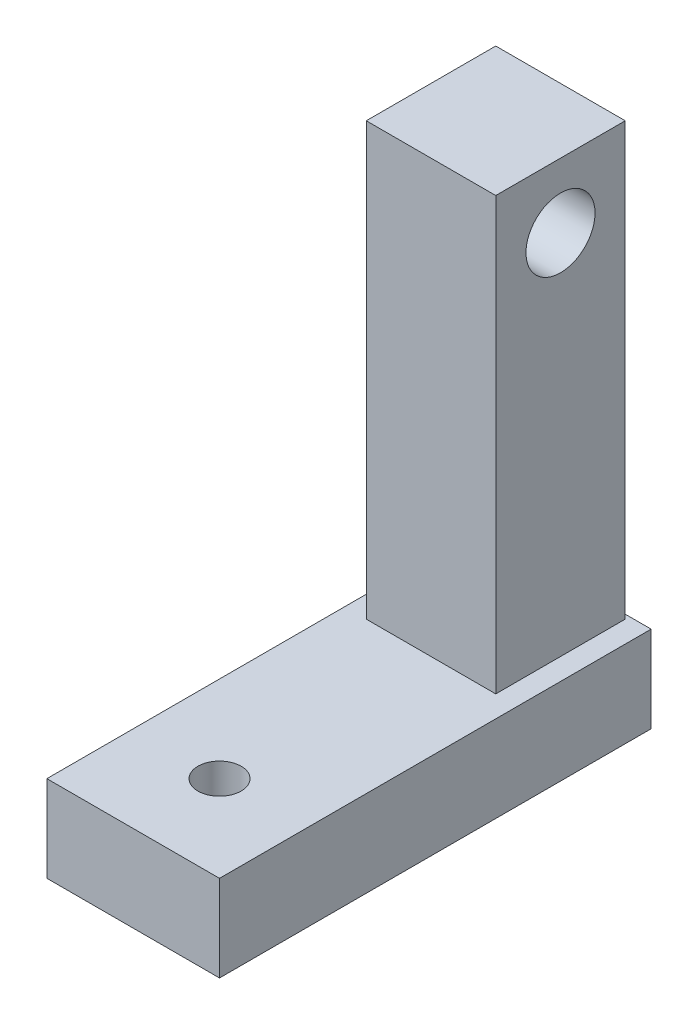
ISO-10303-21;
HEADER;
FILE_DESCRIPTION(('STEP AP214'),'2;1');
FILE_NAME('part.step','',(''),(''),'','','');
FILE_SCHEMA(('AUTOMOTIVE_DESIGN { 1 0 10303 214 1 1 1 1 }'));
ENDSEC;
DATA;
#1=APPLICATION_CONTEXT('core data for automotive mechanical design processes');
#2=APPLICATION_PROTOCOL_DEFINITION('international standard','automotive_design',2000,#1);
#3=PRODUCT_CONTEXT('',#1,'mechanical');
#4=PRODUCT('Part','Part','',(#3));
#5=PRODUCT_RELATED_PRODUCT_CATEGORY('part','',(#4));
#6=PRODUCT_DEFINITION_FORMATION('','',#4);
#7=PRODUCT_DEFINITION_CONTEXT('part definition',#1,'design');
#8=PRODUCT_DEFINITION('design','',#6,#7);
#9=PRODUCT_DEFINITION_SHAPE('','',#8);
#10=(LENGTH_UNIT() NAMED_UNIT(*) SI_UNIT(.MILLI.,.METRE.));
#11=(NAMED_UNIT(*) PLANE_ANGLE_UNIT() SI_UNIT($,.RADIAN.));
#12=(NAMED_UNIT(*) SI_UNIT($,.STERADIAN.) SOLID_ANGLE_UNIT());
#13=UNCERTAINTY_MEASURE_WITH_UNIT(LENGTH_MEASURE(1.E-05),#10,'distance_accuracy_value','');
#14=(GEOMETRIC_REPRESENTATION_CONTEXT(3) GLOBAL_UNCERTAINTY_ASSIGNED_CONTEXT((#13)) GLOBAL_UNIT_ASSIGNED_CONTEXT((#10,
#11,#12)) REPRESENTATION_CONTEXT('',''));
#15=CARTESIAN_POINT('',(0.,0.,0.));
#16=DIRECTION('',(0.,0.,1.));
#17=DIRECTION('',(1.,0.,0.));
#18=AXIS2_PLACEMENT_3D('',#15,#16,#17);
#19=CARTESIAN_POINT('',(-7.50000000000001,60.,-24.5));
#20=DIRECTION('',(1.,0.,0.));
#21=DIRECTION('',(0.,0.,-1.));
#22=AXIS2_PLACEMENT_3D('',#19,#20,#21);
#23=PLANE('',#22);
#24=CARTESIAN_POINT('',(-7.50000000000001,52.5,-17.));
#25=DIRECTION('',(1.,0.,0.));
#26=DIRECTION('',(0.,0.,-1.));
#27=AXIS2_PLACEMENT_3D('',#24,#25,#26);
#28=CIRCLE('',#27,3.99999999999999);
#29=CARTESIAN_POINT('',(-7.50000000000001,52.5,-21.));
#30=VERTEX_POINT('',#29);
#31=EDGE_CURVE('E109',#30,#30,#28,.T.);
#32=ORIENTED_EDGE('',*,*,#31,.T.);
#33=EDGE_LOOP('',(#32));
#34=FACE_BOUND('',#33,.T.);
#35=DIRECTION('',(0.,0.,1.));
#36=VECTOR('',#35,1.);
#37=CARTESIAN_POINT('',(-7.50000000000001,10.,-24.5));
#38=LINE('',#37,#36);
#39=CARTESIAN_POINT('',(-7.50000000000001,10.,-24.5));
#40=VERTEX_POINT('',#39);
#41=CARTESIAN_POINT('',(-7.50000000000001,10.,-9.5));
#42=VERTEX_POINT('',#41);
#43=EDGE_CURVE('E106',#40,#42,#38,.T.);
#44=ORIENTED_EDGE('',*,*,#43,.T.);
#45=DIRECTION('',(0.,-1.,0.));
#46=VECTOR('',#45,1.);
#47=CARTESIAN_POINT('',(-7.50000000000001,60.,-9.5));
#48=LINE('',#47,#46);
#49=CARTESIAN_POINT('',(-7.50000000000001,60.,-9.5));
#50=VERTEX_POINT('',#49);
#51=EDGE_CURVE('E12',#50,#42,#48,.T.);
#52=ORIENTED_EDGE('',*,*,#51,.F.);
#53=DIRECTION('',(0.,0.,1.));
#54=VECTOR('',#53,1.);
#55=CARTESIAN_POINT('',(-7.50000000000001,60.,-24.5));
#56=LINE('',#55,#54);
#57=CARTESIAN_POINT('',(-7.50000000000001,60.,-24.5));
#58=VERTEX_POINT('',#57);
#59=EDGE_CURVE('E94',#58,#50,#56,.T.);
#60=ORIENTED_EDGE('',*,*,#59,.F.);
#61=DIRECTION('',(0.,-1.,0.));
#62=VECTOR('',#61,1.);
#63=CARTESIAN_POINT('',(-7.50000000000001,60.,-24.5));
#64=LINE('',#63,#62);
#65=EDGE_CURVE('E102',#58,#40,#64,.T.);
#66=ORIENTED_EDGE('',*,*,#65,.T.);
#67=EDGE_LOOP('',(#44,#52,#60,#66));
#68=FACE_BOUND('',#67,.T.);
#69=ADVANCED_FACE('F43',(#34,#68),#23,.F.);
#70=CARTESIAN_POINT('',(-7.50000000000001,60.,-9.5));
#71=DIRECTION('',(0.,0.,-1.));
#72=DIRECTION('',(-1.,0.,0.));
#73=AXIS2_PLACEMENT_3D('',#70,#71,#72);
#74=PLANE('',#73);
#75=DIRECTION('',(1.,0.,0.));
#76=VECTOR('',#75,1.);
#77=CARTESIAN_POINT('',(-7.50000000000001,10.,-9.5));
#78=LINE('',#77,#76);
#79=CARTESIAN_POINT('',(7.50000000000001,10.,-9.5));
#80=VERTEX_POINT('',#79);
#81=EDGE_CURVE('E98',#42,#80,#78,.T.);
#82=ORIENTED_EDGE('',*,*,#81,.T.);
#83=DIRECTION('',(0.,-1.,0.));
#84=VECTOR('',#83,1.);
#85=CARTESIAN_POINT('',(7.50000000000001,60.,-9.5));
#86=LINE('',#85,#84);
#87=CARTESIAN_POINT('',(7.50000000000001,60.,-9.5));
#88=VERTEX_POINT('',#87);
#89=EDGE_CURVE('E51',#88,#80,#86,.T.);
#90=ORIENTED_EDGE('',*,*,#89,.F.);
#91=DIRECTION('',(1.,0.,0.));
#92=VECTOR('',#91,1.);
#93=CARTESIAN_POINT('',(-7.50000000000001,60.,-9.5));
#94=LINE('',#93,#92);
#95=EDGE_CURVE('E89',#50,#88,#94,.T.);
#96=ORIENTED_EDGE('',*,*,#95,.F.);
#97=ORIENTED_EDGE('',*,*,#51,.T.);
#98=EDGE_LOOP('',(#82,#90,#96,#97));
#99=FACE_BOUND('',#98,.T.);
#100=ADVANCED_FACE('F97',(#99),#74,.F.);
#101=CARTESIAN_POINT('',(7.49999999999999,60.,-24.5));
#102=DIRECTION('',(-1.,0.,0.));
#103=DIRECTION('',(0.,0.,1.));
#104=AXIS2_PLACEMENT_3D('',#101,#102,#103);
#105=PLANE('',#104);
#106=CARTESIAN_POINT('',(7.5,52.5,-17.));
#107=DIRECTION('',(1.,0.,0.));
#108=DIRECTION('',(0.,0.,-1.));
#109=AXIS2_PLACEMENT_3D('',#106,#107,#108);
#110=CIRCLE('',#109,3.99999999999999);
#111=CARTESIAN_POINT('',(7.5,52.5,-21.));
#112=VERTEX_POINT('',#111);
#113=EDGE_CURVE('E122',#112,#112,#110,.T.);
#114=ORIENTED_EDGE('',*,*,#113,.F.);
#115=EDGE_LOOP('',(#114));
#116=FACE_BOUND('',#115,.T.);
#117=DIRECTION('',(0.,0.,-1.));
#118=VECTOR('',#117,1.);
#119=CARTESIAN_POINT('',(7.49999999999999,10.,-24.5));
#120=LINE('',#119,#118);
#121=CARTESIAN_POINT('',(7.49999999999999,10.,-24.5));
#122=VERTEX_POINT('',#121);
#123=EDGE_CURVE('E76',#80,#122,#120,.T.);
#124=ORIENTED_EDGE('',*,*,#123,.T.);
#125=DIRECTION('',(0.,-1.,0.));
#126=VECTOR('',#125,1.);
#127=CARTESIAN_POINT('',(7.49999999999999,60.,-24.5));
#128=LINE('',#127,#126);
#129=CARTESIAN_POINT('',(7.49999999999999,60.,-24.5));
#130=VERTEX_POINT('',#129);
#131=EDGE_CURVE('E99',#130,#122,#128,.T.);
#132=ORIENTED_EDGE('',*,*,#131,.F.);
#133=DIRECTION('',(0.,0.,-1.));
#134=VECTOR('',#133,1.);
#135=CARTESIAN_POINT('',(7.49999999999999,60.,-24.5));
#136=LINE('',#135,#134);
#137=EDGE_CURVE('E92',#88,#130,#136,.T.);
#138=ORIENTED_EDGE('',*,*,#137,.F.);
#139=ORIENTED_EDGE('',*,*,#89,.T.);
#140=EDGE_LOOP('',(#124,#132,#138,#139));
#141=FACE_BOUND('',#140,.T.);
#142=ADVANCED_FACE('F100',(#116,#141),#105,.F.);
#143=CARTESIAN_POINT('',(-7.50000000000001,60.,-24.5));
#144=DIRECTION('',(0.,0.,1.));
#145=DIRECTION('',(1.,0.,0.));
#146=AXIS2_PLACEMENT_3D('',#143,#144,#145);
#147=PLANE('',#146);
#148=DIRECTION('',(-1.,0.,0.));
#149=VECTOR('',#148,1.);
#150=CARTESIAN_POINT('',(-7.50000000000001,10.,-24.5));
#151=LINE('',#150,#149);
#152=EDGE_CURVE('E82',#122,#40,#151,.T.);
#153=ORIENTED_EDGE('',*,*,#152,.T.);
#154=ORIENTED_EDGE('',*,*,#65,.F.);
#155=DIRECTION('',(-1.,0.,0.));
#156=VECTOR('',#155,1.);
#157=CARTESIAN_POINT('',(-7.50000000000001,60.,-24.5));
#158=LINE('',#157,#156);
#159=EDGE_CURVE('E59',#130,#58,#158,.T.);
#160=ORIENTED_EDGE('',*,*,#159,.F.);
#161=ORIENTED_EDGE('',*,*,#131,.T.);
#162=EDGE_LOOP('',(#153,#154,#160,#161));
#163=FACE_BOUND('',#162,.T.);
#164=ADVANCED_FACE('F114',(#163),#147,.F.);
#165=CARTESIAN_POINT('',(0.,60.,0.));
#166=DIRECTION('',(0.,1.,0.));
#167=DIRECTION('',(0.,0.,1.));
#168=AXIS2_PLACEMENT_3D('',#165,#166,#167);
#169=PLANE('',#168);
#170=ORIENTED_EDGE('',*,*,#59,.T.);
#171=ORIENTED_EDGE('',*,*,#95,.T.);
#172=ORIENTED_EDGE('',*,*,#137,.T.);
#173=ORIENTED_EDGE('',*,*,#159,.T.);
#174=EDGE_LOOP('',(#170,#171,#172,#173));
#175=FACE_BOUND('',#174,.T.);
#176=ADVANCED_FACE('F90',(#175),#169,.T.);
#177=CARTESIAN_POINT('',(0.,10.,0.));
#178=DIRECTION('',(0.,1.,0.));
#179=DIRECTION('',(0.,0.,1.));
#180=AXIS2_PLACEMENT_3D('',#177,#178,#179);
#181=PLANE('',#180);
#182=ORIENTED_EDGE('',*,*,#43,.F.);
#183=ORIENTED_EDGE('',*,*,#152,.F.);
#184=ORIENTED_EDGE('',*,*,#123,.F.);
#185=ORIENTED_EDGE('',*,*,#81,.F.);
#186=EDGE_LOOP('',(#182,#183,#184,#185));
#187=FACE_BOUND('',#186,.T.);
#188=ADVANCED_FACE('F117',(#187),#181,.F.);
#189=CARTESIAN_POINT('',(-10.,52.5,-17.));
#190=DIRECTION('',(1.,0.,0.));
#191=DIRECTION('',(0.,0.,-1.));
#192=AXIS2_PLACEMENT_3D('',#189,#190,#191);
#193=CYLINDRICAL_SURFACE('',#192,3.99999999999999);
#194=ORIENTED_EDGE('',*,*,#113,.T.);
#195=EDGE_LOOP('',(#194));
#196=FACE_BOUND('',#195,.T.);
#197=ORIENTED_EDGE('',*,*,#31,.F.);
#198=EDGE_LOOP('',(#197));
#199=FACE_BOUND('',#198,.T.);
#200=ADVANCED_FACE('F126',(#196,#199),#193,.F.);
#201=CLOSED_SHELL('',(#69,#100,#142,#164,#176,#188,#200));
#202=MANIFOLD_SOLID_BREP('B2',#201);
#203=CARTESIAN_POINT('',(0.,10.,0.));
#204=DIRECTION('',(0.,1.,0.));
#205=DIRECTION('',(0.,0.,1.));
#206=AXIS2_PLACEMENT_3D('',#203,#204,#205);
#207=PLANE('',#206);
#208=CARTESIAN_POINT('',(0.,10.,15.));
#209=DIRECTION('',(0.,1.,0.));
#210=DIRECTION('',(0.,0.,1.));
#211=AXIS2_PLACEMENT_3D('',#208,#209,#210);
#212=CIRCLE('',#211,2.5);
#213=CARTESIAN_POINT('',(0.,10.,17.5));
#214=VERTEX_POINT('',#213);
#215=EDGE_CURVE('E255',#214,#214,#212,.T.);
#216=ORIENTED_EDGE('',*,*,#215,.F.);
#217=EDGE_LOOP('',(#216));
#218=FACE_BOUND('',#217,.T.);
#219=DIRECTION('',(0.,0.,1.));
#220=VECTOR('',#219,1.);
#221=CARTESIAN_POINT('',(-10.,10.,-25.));
#222=LINE('',#221,#220);
#223=CARTESIAN_POINT('',(-10.,10.,-25.));
#224=VERTEX_POINT('',#223);
#225=CARTESIAN_POINT('',(-9.99999999999999,10.,25.));
#226=VERTEX_POINT('',#225);
#227=EDGE_CURVE('E240',#224,#226,#222,.T.);
#228=ORIENTED_EDGE('',*,*,#227,.T.);
#229=DIRECTION('',(1.,0.,0.));
#230=VECTOR('',#229,1.);
#231=CARTESIAN_POINT('',(-9.99999999999999,10.,25.));
#232=LINE('',#231,#230);
#233=CARTESIAN_POINT('',(10.,10.,25.));
#234=VERTEX_POINT('',#233);
#235=EDGE_CURVE('E235',#226,#234,#232,.T.);
#236=ORIENTED_EDGE('',*,*,#235,.T.);
#237=DIRECTION('',(0.,0.,-1.));
#238=VECTOR('',#237,1.);
#239=CARTESIAN_POINT('',(10.,10.,-25.));
#240=LINE('',#239,#238);
#241=CARTESIAN_POINT('',(10.,10.,-25.));
#242=VERTEX_POINT('',#241);
#243=EDGE_CURVE('E238',#234,#242,#240,.T.);
#244=ORIENTED_EDGE('',*,*,#243,.T.);
#245=DIRECTION('',(-1.,0.,0.));
#246=VECTOR('',#245,1.);
#247=CARTESIAN_POINT('',(-10.,10.,-25.));
#248=LINE('',#247,#246);
#249=EDGE_CURVE('E205',#242,#224,#248,.T.);
#250=ORIENTED_EDGE('',*,*,#249,.T.);
#251=EDGE_LOOP('',(#228,#236,#244,#250));
#252=FACE_BOUND('',#251,.T.);
#253=CARTESIAN_POINT('',(0.,10.,-15.));
#254=DIRECTION('',(0.,1.,0.));
#255=DIRECTION('',(0.,0.,1.));
#256=AXIS2_PLACEMENT_3D('',#253,#254,#255);
#257=CIRCLE('',#256,2.5);
#258=CARTESIAN_POINT('',(0.,10.,-12.5));
#259=VERTEX_POINT('',#258);
#260=EDGE_CURVE('E270',#259,#259,#257,.T.);
#261=ORIENTED_EDGE('',*,*,#260,.F.);
#262=EDGE_LOOP('',(#261));
#263=FACE_BOUND('',#262,.T.);
#264=ADVANCED_FACE('F188',(#218,#252,#263),#207,.T.);
#265=CARTESIAN_POINT('',(0.,0.,0.));
#266=DIRECTION('',(0.,1.,0.));
#267=DIRECTION('',(0.,0.,1.));
#268=AXIS2_PLACEMENT_3D('',#265,#266,#267);
#269=PLANE('',#268);
#270=CARTESIAN_POINT('',(0.,0.,15.));
#271=DIRECTION('',(0.,1.,0.));
#272=DIRECTION('',(0.,0.,1.));
#273=AXIS2_PLACEMENT_3D('',#270,#271,#272);
#274=CIRCLE('',#273,2.5);
#275=CARTESIAN_POINT('',(0.,0.,17.5));
#276=VERTEX_POINT('',#275);
#277=EDGE_CURVE('E267',#276,#276,#274,.T.);
#278=ORIENTED_EDGE('',*,*,#277,.T.);
#279=EDGE_LOOP('',(#278));
#280=FACE_BOUND('',#279,.T.);
#281=DIRECTION('',(0.,0.,1.));
#282=VECTOR('',#281,1.);
#283=CARTESIAN_POINT('',(-10.,0.,-25.));
#284=LINE('',#283,#282);
#285=CARTESIAN_POINT('',(-10.,0.,-25.));
#286=VERTEX_POINT('',#285);
#287=CARTESIAN_POINT('',(-9.99999999999999,0.,25.));
#288=VERTEX_POINT('',#287);
#289=EDGE_CURVE('E252',#286,#288,#284,.T.);
#290=ORIENTED_EDGE('',*,*,#289,.F.);
#291=DIRECTION('',(-1.,0.,0.));
#292=VECTOR('',#291,1.);
#293=CARTESIAN_POINT('',(-10.,0.,-25.));
#294=LINE('',#293,#292);
#295=CARTESIAN_POINT('',(10.,0.,-25.));
#296=VERTEX_POINT('',#295);
#297=EDGE_CURVE('E228',#296,#286,#294,.T.);
#298=ORIENTED_EDGE('',*,*,#297,.F.);
#299=DIRECTION('',(0.,0.,-1.));
#300=VECTOR('',#299,1.);
#301=CARTESIAN_POINT('',(10.,0.,-25.));
#302=LINE('',#301,#300);
#303=CARTESIAN_POINT('',(10.,0.,25.));
#304=VERTEX_POINT('',#303);
#305=EDGE_CURVE('E222',#304,#296,#302,.T.);
#306=ORIENTED_EDGE('',*,*,#305,.F.);
#307=DIRECTION('',(1.,0.,0.));
#308=VECTOR('',#307,1.);
#309=CARTESIAN_POINT('',(-9.99999999999999,0.,25.));
#310=LINE('',#309,#308);
#311=EDGE_CURVE('E244',#288,#304,#310,.T.);
#312=ORIENTED_EDGE('',*,*,#311,.F.);
#313=EDGE_LOOP('',(#290,#298,#306,#312));
#314=FACE_BOUND('',#313,.T.);
#315=CARTESIAN_POINT('',(0.,0.,-15.));
#316=DIRECTION('',(0.,1.,0.));
#317=DIRECTION('',(0.,0.,1.));
#318=AXIS2_PLACEMENT_3D('',#315,#316,#317);
#319=CIRCLE('',#318,2.5);
#320=CARTESIAN_POINT('',(0.,0.,-12.5));
#321=VERTEX_POINT('',#320);
#322=EDGE_CURVE('E273',#321,#321,#319,.T.);
#323=ORIENTED_EDGE('',*,*,#322,.T.);
#324=EDGE_LOOP('',(#323));
#325=FACE_BOUND('',#324,.T.);
#326=ADVANCED_FACE('F263',(#280,#314,#325),#269,.F.);
#327=CARTESIAN_POINT('',(-10.,10.,-25.));
#328=DIRECTION('',(1.,0.,0.));
#329=DIRECTION('',(0.,0.,-1.));
#330=AXIS2_PLACEMENT_3D('',#327,#328,#329);
#331=PLANE('',#330);
#332=ORIENTED_EDGE('',*,*,#289,.T.);
#333=DIRECTION('',(0.,-1.,0.));
#334=VECTOR('',#333,1.);
#335=CARTESIAN_POINT('',(-9.99999999999999,10.,25.));
#336=LINE('',#335,#334);
#337=EDGE_CURVE('E41',#226,#288,#336,.T.);
#338=ORIENTED_EDGE('',*,*,#337,.F.);
#339=ORIENTED_EDGE('',*,*,#227,.F.);
#340=DIRECTION('',(0.,-1.,0.));
#341=VECTOR('',#340,1.);
#342=CARTESIAN_POINT('',(-10.,10.,-25.));
#343=LINE('',#342,#341);
#344=EDGE_CURVE('E248',#224,#286,#343,.T.);
#345=ORIENTED_EDGE('',*,*,#344,.T.);
#346=EDGE_LOOP('',(#332,#338,#339,#345));
#347=FACE_BOUND('',#346,.T.);
#348=ADVANCED_FACE('F190',(#347),#331,.F.);
#349=CARTESIAN_POINT('',(-9.99999999999999,10.,25.));
#350=DIRECTION('',(0.,0.,-1.));
#351=DIRECTION('',(-1.,0.,0.));
#352=AXIS2_PLACEMENT_3D('',#349,#350,#351);
#353=PLANE('',#352);
#354=ORIENTED_EDGE('',*,*,#311,.T.);
#355=DIRECTION('',(0.,-1.,0.));
#356=VECTOR('',#355,1.);
#357=CARTESIAN_POINT('',(10.,10.,25.));
#358=LINE('',#357,#356);
#359=EDGE_CURVE('E197',#234,#304,#358,.T.);
#360=ORIENTED_EDGE('',*,*,#359,.F.);
#361=ORIENTED_EDGE('',*,*,#235,.F.);
#362=ORIENTED_EDGE('',*,*,#337,.T.);
#363=EDGE_LOOP('',(#354,#360,#361,#362));
#364=FACE_BOUND('',#363,.T.);
#365=ADVANCED_FACE('F243',(#364),#353,.F.);
#366=CARTESIAN_POINT('',(10.,10.,-25.));
#367=DIRECTION('',(-1.,0.,0.));
#368=DIRECTION('',(0.,0.,1.));
#369=AXIS2_PLACEMENT_3D('',#366,#367,#368);
#370=PLANE('',#369);
#371=ORIENTED_EDGE('',*,*,#305,.T.);
#372=DIRECTION('',(0.,-1.,0.));
#373=VECTOR('',#372,1.);
#374=CARTESIAN_POINT('',(10.,10.,-25.));
#375=LINE('',#374,#373);
#376=EDGE_CURVE('E245',#242,#296,#375,.T.);
#377=ORIENTED_EDGE('',*,*,#376,.F.);
#378=ORIENTED_EDGE('',*,*,#243,.F.);
#379=ORIENTED_EDGE('',*,*,#359,.T.);
#380=EDGE_LOOP('',(#371,#377,#378,#379));
#381=FACE_BOUND('',#380,.T.);
#382=ADVANCED_FACE('F246',(#381),#370,.F.);
#383=CARTESIAN_POINT('',(-10.,10.,-25.));
#384=DIRECTION('',(0.,0.,1.));
#385=DIRECTION('',(1.,0.,0.));
#386=AXIS2_PLACEMENT_3D('',#383,#384,#385);
#387=PLANE('',#386);
#388=ORIENTED_EDGE('',*,*,#297,.T.);
#389=ORIENTED_EDGE('',*,*,#344,.F.);
#390=ORIENTED_EDGE('',*,*,#249,.F.);
#391=ORIENTED_EDGE('',*,*,#376,.T.);
#392=EDGE_LOOP('',(#388,#389,#390,#391));
#393=FACE_BOUND('',#392,.T.);
#394=ADVANCED_FACE('F260',(#393),#387,.F.);
#395=CARTESIAN_POINT('',(0.,10.,15.));
#396=DIRECTION('',(0.,-1.,0.));
#397=DIRECTION('',(0.,0.,-1.));
#398=AXIS2_PLACEMENT_3D('',#395,#396,#397);
#399=CYLINDRICAL_SURFACE('',#398,2.5);
#400=ORIENTED_EDGE('',*,*,#215,.T.);
#401=EDGE_LOOP('',(#400));
#402=FACE_BOUND('',#401,.T.);
#403=ORIENTED_EDGE('',*,*,#277,.F.);
#404=EDGE_LOOP('',(#403));
#405=FACE_BOUND('',#404,.T.);
#406=ADVANCED_FACE('F291',(#402,#405),#399,.F.);
#407=CARTESIAN_POINT('',(0.,10.,-15.));
#408=DIRECTION('',(0.,-1.,0.));
#409=DIRECTION('',(0.,0.,-1.));
#410=AXIS2_PLACEMENT_3D('',#407,#408,#409);
#411=CYLINDRICAL_SURFACE('',#410,2.5);
#412=ORIENTED_EDGE('',*,*,#260,.T.);
#413=EDGE_LOOP('',(#412));
#414=FACE_BOUND('',#413,.T.);
#415=ORIENTED_EDGE('',*,*,#322,.F.);
#416=EDGE_LOOP('',(#415));
#417=FACE_BOUND('',#416,.T.);
#418=ADVANCED_FACE('F279',(#414,#417),#411,.F.);
#419=CLOSED_SHELL('',(#264,#326,#348,#365,#382,#394,#406,#418));
#420=MANIFOLD_SOLID_BREP('B6',#419);
#421=ADVANCED_BREP_SHAPE_REPRESENTATION('',(#18,#202,#420),#14);
#422=SHAPE_DEFINITION_REPRESENTATION(#9,#421);
ENDSEC;
END-ISO-10303-21;
